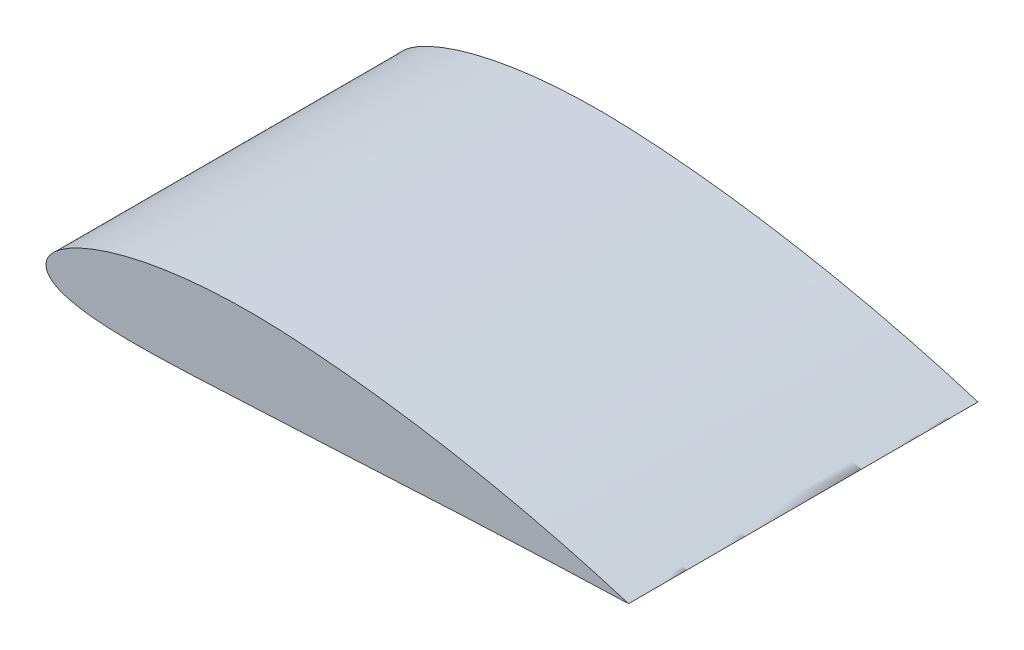
ISO-10303-21;
HEADER;
FILE_DESCRIPTION(('STEP AP214'),'2;1');
FILE_NAME('part.step','',(''),(''),'','','');
FILE_SCHEMA(('AUTOMOTIVE_DESIGN { 1 0 10303 214 1 1 1 1 }'));
ENDSEC;
DATA;
#1=APPLICATION_CONTEXT('core data for automotive mechanical design processes');
#2=APPLICATION_PROTOCOL_DEFINITION('international standard','automotive_design',2000,#1);
#3=PRODUCT_CONTEXT('',#1,'mechanical');
#4=PRODUCT('Part','Part','',(#3));
#5=PRODUCT_RELATED_PRODUCT_CATEGORY('part','',(#4));
#6=PRODUCT_DEFINITION_FORMATION('','',#4);
#7=PRODUCT_DEFINITION_CONTEXT('part definition',#1,'design');
#8=PRODUCT_DEFINITION('design','',#6,#7);
#9=PRODUCT_DEFINITION_SHAPE('','',#8);
#10=(LENGTH_UNIT() NAMED_UNIT(*) SI_UNIT(.MILLI.,.METRE.));
#11=(NAMED_UNIT(*) PLANE_ANGLE_UNIT() SI_UNIT($,.RADIAN.));
#12=(NAMED_UNIT(*) SI_UNIT($,.STERADIAN.) SOLID_ANGLE_UNIT());
#13=UNCERTAINTY_MEASURE_WITH_UNIT(LENGTH_MEASURE(1.E-05),#10,'distance_accuracy_value','');
#14=(GEOMETRIC_REPRESENTATION_CONTEXT(3) GLOBAL_UNCERTAINTY_ASSIGNED_CONTEXT((#13)) GLOBAL_UNIT_ASSIGNED_CONTEXT((#10,
#11,#12)) REPRESENTATION_CONTEXT('',''));
#15=CARTESIAN_POINT('',(0.,0.,0.));
#16=DIRECTION('',(0.,0.,1.));
#17=DIRECTION('',(1.,0.,0.));
#18=AXIS2_PLACEMENT_3D('',#15,#16,#17);
#19=CARTESIAN_POINT('',(150.,0.,90.));
#20=CARTESIAN_POINT('',(150.000272104422,0.00207689023263009,90.));
#21=CARTESIAN_POINT('',(149.921973551547,0.0208426262092277,90.));
#22=CARTESIAN_POINT('',(149.842519038282,0.0504847005717194,90.));
#23=CARTESIAN_POINT('',(149.645315709545,0.108295906032166,90.));
#24=CARTESIAN_POINT('',(149.399874004555,0.184870334594353,90.));
#25=CARTESIAN_POINT('',(149.072414173413,0.284434688746268,90.));
#26=CARTESIAN_POINT('',(148.677343737494,0.405292385609757,90.));
#27=CARTESIAN_POINT('',(148.209483066083,0.546896462907407,90.));
#28=CARTESIAN_POINT('',(147.671383631488,0.709511432527617,90.));
#29=CARTESIAN_POINT('',(147.062641823663,0.892173175665108,90.));
#30=CARTESIAN_POINT('',(146.38404891698,1.09421049196099,90.));
#31=CARTESIAN_POINT('',(145.636148319458,1.31544577946298,90.));
#32=CARTESIAN_POINT('',(144.819611323107,1.55506497229126,90.));
#33=CARTESIAN_POINT('',(143.935051630073,1.81221578260426,90.));
#34=CARTESIAN_POINT('',(142.98329626284,2.08618396516425,90.));
#35=CARTESIAN_POINT('',(141.965168506429,2.37612722327041,90.));
#36=CARTESIAN_POINT('',(140.881543015728,2.6815104069107,90.));
#37=CARTESIAN_POINT('',(139.733311673354,3.00109894583133,90.));
#38=CARTESIAN_POINT('',(138.521573964146,3.33443569112062,90.));
#39=CARTESIAN_POINT('',(137.247259695871,3.67967787535828,90.));
#40=CARTESIAN_POINT('',(135.911779029487,4.03729575748827,90.));
#41=CARTESIAN_POINT('',(134.515919656966,4.40471208076963,90.));
#42=CARTESIAN_POINT('',(133.061288331017,4.78231347303156,90.));
#43=CARTESIAN_POINT('',(131.548973045965,5.16800610284615,90.));
#44=CARTESIAN_POINT('',(129.980544735221,5.56154750441059,90.));
#45=CARTESIAN_POINT('',(128.35725708645,5.96141132811702,90.));
#46=CARTESIAN_POINT('',(126.680668839588,6.36693677300439,90.));
#47=CARTESIAN_POINT('',(124.952285557257,6.77668675307357,90.));
#48=CARTESIAN_POINT('',(123.173710005076,7.18982645179692,90.));
#49=CARTESIAN_POINT('',(121.346696760796,7.60533214426128,90.));
#50=CARTESIAN_POINT('',(119.472806812605,8.02202963775829,90.));
#51=CARTESIAN_POINT('',(117.553944689906,8.43906525798075,90.));
#52=CARTESIAN_POINT('',(115.591819417726,8.85520805754498,90.));
#53=CARTESIAN_POINT('',(113.588294477563,9.26926792690191,90.));
#54=CARTESIAN_POINT('',(111.545360234912,9.68088947320699,90.));
#55=CARTESIAN_POINT('',(109.464827039027,10.0881802086501,90.));
#56=CARTESIAN_POINT('',(107.348799553894,10.490864841984,90.));
#57=CARTESIAN_POINT('',(105.199373577835,10.8876864936163,90.));
#58=CARTESIAN_POINT('',(103.018484494341,11.277318393923,90.));
#59=CARTESIAN_POINT('',(100.808431903456,11.6595648966439,90.));
#60=CARTESIAN_POINT('',(98.5711340995122,12.0325224405796,90.));
#61=CARTESIAN_POINT('',(96.3089959207087,12.3961047323509,90.));
#62=CARTESIAN_POINT('',(94.0241310079003,12.7489466185652,90.));
#63=CARTESIAN_POINT('',(91.718883116714,13.0903325986072,90.));
#64=CARTESIAN_POINT('',(89.3954275691228,13.4189345008477,90.));
#65=CARTESIAN_POINT('',(87.0562887944019,13.7347453196045,90.));
#66=CARTESIAN_POINT('',(84.7036052332807,14.0361643345996,90.));
#67=CARTESIAN_POINT('',(82.3398249346409,14.3226387688156,90.));
#68=CARTESIAN_POINT('',(79.967325410036,14.5932708330258,90.));
#69=CARTESIAN_POINT('',(77.5885654116206,14.8478211325833,90.));
#70=CARTESIAN_POINT('',(75.2058897790264,15.0846236941612,90.));
#71=CARTESIAN_POINT('',(72.8217697700285,15.3041043020901,90.));
#72=CARTESIAN_POINT('',(70.4386522230854,15.5045852412791,90.));
#73=CARTESIAN_POINT('',(68.0589891278915,15.68594497707,90.));
#74=CARTESIAN_POINT('',(65.6852844488684,15.8477677068933,90.));
#75=CARTESIAN_POINT('',(63.3199558506742,15.9890376852295,90.));
#76=CARTESIAN_POINT('',(60.9569868820646,16.1102204847538,90.));
#77=CARTESIAN_POINT('',(58.5927592112426,16.2095296702894,90.));
#78=CARTESIAN_POINT('',(56.2293299635351,16.2751546551305,90.));
#79=CARTESIAN_POINT('',(53.8780778954161,16.3100321973821,90.));
#80=CARTESIAN_POINT('',(51.5475071673821,16.3124265374074,90.));
#81=CARTESIAN_POINT('',(49.2403315805647,16.2832747914698,90.));
#82=CARTESIAN_POINT('',(46.95915252198,16.2221891848616,90.));
#83=CARTESIAN_POINT('',(44.7066225129721,16.1297818940888,90.));
#84=CARTESIAN_POINT('',(42.4853651736782,16.0066871374737,90.));
#85=CARTESIAN_POINT('',(40.2979451525518,15.8525073101211,90.));
#86=CARTESIAN_POINT('',(38.146881081899,15.6689733062392,90.));
#87=CARTESIAN_POINT('',(36.0346303680516,15.4560352697872,90.));
#88=CARTESIAN_POINT('',(33.963718149193,15.2147017968168,90.));
#89=CARTESIAN_POINT('',(31.9364386243261,14.9456064642803,90.));
#90=CARTESIAN_POINT('',(29.9550852199295,14.650431122317,90.));
#91=CARTESIAN_POINT('',(28.0219995377294,14.329328289204,90.));
#92=CARTESIAN_POINT('',(26.1393036636904,13.9841488004247,90.));
#93=CARTESIAN_POINT('',(24.3090897042164,13.6156080862152,90.));
#94=CARTESIAN_POINT('',(22.5333910183897,13.2252998236428,90.));
#95=CARTESIAN_POINT('',(20.8141570646472,12.8143397994462,90.));
#96=CARTESIAN_POINT('',(19.1532625454956,12.3843673513931,90.));
#97=CARTESIAN_POINT('',(17.5525314026896,11.9363688305201,90.));
#98=CARTESIAN_POINT('',(16.0135453188172,11.4723789338875,90.));
#99=CARTESIAN_POINT('',(14.5379658289888,10.9933978448908,90.));
#100=CARTESIAN_POINT('',(13.1271795372412,10.5014156983785,90.));
#101=CARTESIAN_POINT('',(11.7826686973959,9.99758517013954,90.));
#102=CARTESIAN_POINT('',(10.5056360590066,9.4838301684593,90.));
#103=CARTESIAN_POINT('',(9.29757901129565,8.96091465996717,90.));
#104=CARTESIAN_POINT('',(8.15912225204376,8.43145219524066,90.));
#105=CARTESIAN_POINT('',(7.09167230019978,7.89594980567053,90.));
#106=CARTESIAN_POINT('',(6.09590939489857,7.35643565975766,90.));
#107=CARTESIAN_POINT('',(5.17279962443279,6.81404781774696,90.));
#108=CARTESIAN_POINT('',(4.32279616189373,6.27049877334772,90.));
#109=CARTESIAN_POINT('',(3.54682092194692,5.72651568455543,90.));
#110=CARTESIAN_POINT('',(2.84510723373929,5.18373587366653,90.));
#111=CARTESIAN_POINT('',(2.21827152938012,4.64301683836837,90.));
#112=CARTESIAN_POINT('',(1.66642319468661,4.10552051561501,90.));
#113=CARTESIAN_POINT('',(1.19023442450698,3.57175180699062,90.));
#114=CARTESIAN_POINT('',(0.789296727509486,3.04299046760465,90.));
#115=CARTESIAN_POINT('',(0.464285946917065,2.51936680432351,90.));
#116=CARTESIAN_POINT('',(0.215278880105339,2.00137620213908,90.));
#117=CARTESIAN_POINT('',(0.0428613380577646,1.48932579315468,90.));
#118=CARTESIAN_POINT('',(-0.0530580273602537,0.983851334380554,90.));
#119=CARTESIAN_POINT('',(-0.0712450306698294,0.485498463442419,90.));
#120=CARTESIAN_POINT('',(-0.0123592269447209,-0.00244835719853685,90.));
#121=CARTESIAN_POINT('',(0.120911740768983,-0.475516589249274,90.));
#122=CARTESIAN_POINT('',(0.328830225920756,-0.928469081351905,90.));
#123=CARTESIAN_POINT('',(0.609334298301053,-1.35888318721454,90.));
#124=CARTESIAN_POINT('',(0.961345567012049,-1.76664058544736,90.));
#125=CARTESIAN_POINT('',(1.38409496464228,-2.15163877482725,90.));
#126=CARTESIAN_POINT('',(1.87590746344579,-2.51503021404955,90.));
#127=CARTESIAN_POINT('',(2.43666954822375,-2.85634814965635,90.));
#128=CARTESIAN_POINT('',(3.06497712351144,-3.17677195967994,90.));
#129=CARTESIAN_POINT('',(3.7605653241109,-3.47575656065418,90.));
#130=CARTESIAN_POINT('',(4.52231400391344,-3.75406636830128,90.));
#131=CARTESIAN_POINT('',(5.34942075072481,-4.01191058827112,90.));
#132=CARTESIAN_POINT('',(6.24095359325865,-4.24910176197436,90.));
#133=CARTESIAN_POINT('',(7.19569142683817,-4.46648601041969,90.));
#134=CARTESIAN_POINT('',(8.21269572499256,-4.66365365837422,90.));
#135=CARTESIAN_POINT('',(9.2906866946272,-4.84135328610298,90.));
#136=CARTESIAN_POINT('',(10.4285899742934,-4.99972555658686,90.));
#137=CARTESIAN_POINT('',(11.6251376394179,-5.13937440763286,90.));
#138=CARTESIAN_POINT('',(12.8791605932049,-5.26011203158123,90.));
#139=CARTESIAN_POINT('',(14.1891859121837,-5.36318678706131,90.));
#140=CARTESIAN_POINT('',(15.5539508874596,-5.44820802642055,90.));
#141=CARTESIAN_POINT('',(16.9721094758421,-5.51634875324073,90.));
#142=CARTESIAN_POINT('',(18.4422950309709,-5.56780595958454,90.));
#143=CARTESIAN_POINT('',(19.9631039142276,-5.60321399111864,90.));
#144=CARTESIAN_POINT('',(21.5330881522841,-5.62350162104073,90.));
#145=CARTESIAN_POINT('',(23.1508061715703,-5.62874343844123,90.));
#146=CARTESIAN_POINT('',(24.8148063330218,-5.62040842866065,90.));
#147=CARTESIAN_POINT('',(26.5235445975624,-5.59884059450155,90.));
#148=CARTESIAN_POINT('',(28.2756160734194,-5.56474396820487,90.));
#149=CARTESIAN_POINT('',(30.0694858054297,-5.51946038531307,90.));
#150=CARTESIAN_POINT('',(31.9036890589317,-5.46322094926999,90.));
#151=CARTESIAN_POINT('',(33.7766353517987,-5.3972971211312,90.));
#152=CARTESIAN_POINT('',(35.6867790146822,-5.3227207637968,90.));
#153=CARTESIAN_POINT('',(37.6325678885514,-5.24034726975759,90.));
#154=CARTESIAN_POINT('',(39.6124008659453,-5.15108325425804,90.));
#155=CARTESIAN_POINT('',(41.6246745232964,-5.05590145858239,90.));
#156=CARTESIAN_POINT('',(43.6677620509226,-4.95625598076368,90.));
#157=CARTESIAN_POINT('',(45.7400314366859,-4.85252429231329,90.));
#158=CARTESIAN_POINT('',(47.8398139361709,-4.74627490480082,90.));
#159=CARTESIAN_POINT('',(49.965432617321,-4.63805694152593,90.));
#160=CARTESIAN_POINT('',(52.1151156255718,-4.52941650554317,90.));
#161=CARTESIAN_POINT('',(54.2871400595198,-4.42093378617178,90.));
#162=CARTESIAN_POINT('',(56.4797286201269,-4.31402206765908,90.));
#163=CARTESIAN_POINT('',(58.6969908713433,-4.20849141314161,90.));
#164=CARTESIAN_POINT('',(60.945654882775,-4.10769870768404,90.));
#165=CARTESIAN_POINT('',(63.2232486042912,-4.002236598618,90.));
#166=CARTESIAN_POINT('',(65.5216321109667,-3.89137688011704,90.));
#167=CARTESIAN_POINT('',(67.8301729941364,-3.77675196819679,90.));
#168=CARTESIAN_POINT('',(70.1466614694952,-3.65879491545977,90.));
#169=CARTESIAN_POINT('',(72.4689996031601,-3.53814745300053,90.));
#170=CARTESIAN_POINT('',(74.794988032,-3.4154165014781,90.));
#171=CARTESIAN_POINT('',(77.1224243615471,-3.29115474286348,90.));
#172=CARTESIAN_POINT('',(79.4490677808488,-3.16607980540334,90.));
#173=CARTESIAN_POINT('',(81.7726976546475,-3.04040655331903,90.));
#174=CARTESIAN_POINT('',(84.0911495605708,-2.91524183791421,90.));
#175=CARTESIAN_POINT('',(86.402140444334,-2.79042292169453,90.));
#176=CARTESIAN_POINT('',(88.7034754404547,-2.66644219496335,90.));
#177=CARTESIAN_POINT('',(90.9928775044559,-2.54412756405056,90.));
#178=CARTESIAN_POINT('',(93.2681170734066,-2.42332668707761,90.));
#179=CARTESIAN_POINT('',(95.5269618333438,-2.30466849275584,90.));
#180=CARTESIAN_POINT('',(97.7672176064783,-2.18852225501992,90.));
#181=CARTESIAN_POINT('',(99.986655582846,-2.07457755662578,90.));
#182=CARTESIAN_POINT('',(102.183061875341,-1.96368989137843,90.));
#183=CARTESIAN_POINT('',(104.354254639672,-1.85548180982117,90.));
#184=CARTESIAN_POINT('',(106.498058518328,-1.75054532192651,90.));
#185=CARTESIAN_POINT('',(108.612361753783,-1.64874965871514,90.));
#186=CARTESIAN_POINT('',(110.695005571574,-1.55000356799861,90.));
#187=CARTESIAN_POINT('',(112.743858693049,-1.45480231912397,90.));
#188=CARTESIAN_POINT('',(114.75681445434,-1.36306322999739,90.));
#189=CARTESIAN_POINT('',(116.731816593225,-1.27459804108363,90.));
#190=CARTESIAN_POINT('',(118.666913818065,-1.18936990866941,90.));
#191=CARTESIAN_POINT('',(120.560070381475,-1.10770755043036,90.));
#192=CARTESIAN_POINT('',(122.409370825866,-1.02925607680544,90.));
#193=CARTESIAN_POINT('',(124.212822591308,-0.954136034758562,90.));
#194=CARTESIAN_POINT('',(125.968576681431,-0.882324845493759,90.));
#195=CARTESIAN_POINT('',(127.674782259508,-0.813706732262509,90.));
#196=CARTESIAN_POINT('',(129.32962435176,-0.747897389263747,90.));
#197=CARTESIAN_POINT('',(130.931437587357,-0.685679095937559,90.));
#198=CARTESIAN_POINT('',(132.478432692498,-0.626047056681713,90.));
#199=CARTESIAN_POINT('',(133.968988768561,-0.569602131419002,90.));
#200=CARTESIAN_POINT('',(135.401534107448,-0.51582272078192,90.));
#201=CARTESIAN_POINT('',(136.774542373877,-0.465242147692284,90.));
#202=CARTESIAN_POINT('',(138.086542097674,-0.417233039970525,90.));
#203=CARTESIAN_POINT('',(139.33604307386,-0.371958079112704,90.));
#204=CARTESIAN_POINT('',(140.521692905702,-0.329351465651246,90.));
#205=CARTESIAN_POINT('',(141.642247059827,-0.289517314442345,90.));
#206=CARTESIAN_POINT('',(142.696444473822,-0.252142887573603,90.));
#207=CARTESIAN_POINT('',(143.683143638872,-0.21746993774922,90.));
#208=CARTESIAN_POINT('',(144.601252193673,-0.185655736937105,90.));
#209=CARTESIAN_POINT('',(145.449743160385,-0.155977193568038,90.));
#210=CARTESIAN_POINT('',(146.227705394211,-0.129275623987621,90.));
#211=CARTESIAN_POINT('',(146.934186609138,-0.104721156283502,90.));
#212=CARTESIAN_POINT('',(147.568527129019,-0.0830159570641429,90.));
#213=CARTESIAN_POINT('',(148.129765475862,-0.0638850729192039,90.));
#214=CARTESIAN_POINT('',(148.617909888636,-0.0470248496208151,90.));
#215=CARTESIAN_POINT('',(149.030589151948,-0.0328618602439431,90.));
#216=CARTESIAN_POINT('',(149.372579095089,-0.0216487935241916,90.));
#217=CARTESIAN_POINT('',(149.629433267964,-0.0117842854812042,90.));
#218=CARTESIAN_POINT('',(149.834846904295,-0.00732139561684935,90.));
#219=CARTESIAN_POINT('',(149.919239993652,5.47711858839539E-05,90.));
#220=CARTESIAN_POINT('',(149.999727835646,-0.00207734766865694,90.));
#221=CARTESIAN_POINT('',(150.,0.,90.));
#222=B_SPLINE_CURVE_WITH_KNOTS('',3,(#19,#20,#21,#22,#23,#24,#25,#26,#27,#28,#29,#30,#31,#32,
#33,#34,#35,#36,#37,#38,#39,#40,#41,#42,#43,#44,#45,#46,#47,#48,#49,#50,#51,#52,#53,#54,#55,#56,
#57,#58,#59,#60,#61,#62,#63,#64,#65,#66,#67,#68,#69,#70,#71,#72,#73,#74,#75,#76,#77,#78,#79,#80,
#81,#82,#83,#84,#85,#86,#87,#88,#89,#90,#91,#92,#93,#94,#95,#96,#97,#98,#99,#100,#101,#102,#103,
#104,#105,#106,#107,#108,#109,#110,#111,#112,#113,#114,#115,#116,#117,#118,#119,#120,#121,#122,
#123,#124,#125,#126,#127,#128,#129,#130,#131,#132,#133,#134,#135,#136,#137,#138,#139,#140,#141,
#142,#143,#144,#145,#146,#147,#148,#149,#150,#151,#152,#153,#154,#155,#156,#157,#158,#159,#160,
#161,#162,#163,#164,#165,#166,#167,#168,#169,#170,#171,#172,#173,#174,#175,#176,#177,#178,#179,
#180,#181,#182,#183,#184,#185,#186,#187,#188,#189,#190,#191,#192,#193,#194,#195,#196,#197,#198,
#199,#200,#201,#202,#203,#204,#205,#206,#207,#208,#209,#210,#211,#212,#213,#214,#215,#216,#217,
#218,#219,#220,#221),.UNSPECIFIED.,.T.,.F.,(4,1,1,1,1,1,1,1,1,1,1,1,1,1,1,1,1,1,1,1,1,1,1,1,1,1,
1,1,1,1,1,1,1,1,1,1,1,1,1,1,1,1,1,1,1,1,1,1,1,1,1,1,1,1,1,1,1,1,1,1,1,1,1,1,1,1,1,1,1,1,1,1,1,1,
1,1,1,1,1,1,1,1,1,1,1,1,1,1,1,1,1,1,1,1,1,1,1,1,1,1,1,1,1,1,1,1,1,1,1,1,1,1,1,1,1,1,1,1,1,1,1,1,
1,1,1,1,1,1,1,1,1,1,1,1,1,1,1,1,1,1,1,1,1,1,1,1,1,1,1,1,1,1,1,1,1,1,1,1,1,1,1,1,1,1,1,1,1,1,1,1,
1,1,1,1,1,1,1,1,1,1,1,1,1,1,1,1,1,1,1,1,1,1,1,1,1,1,1,1,1,1,4),(0.,0.000122422828839157,
0.000490298205700145,0.00110255506390439,0.00195844392313843,0.00305782313682848,
0.00439915824740053,0.00598081444162225,0.00780186545934247,0.0098597540126122,
0.0121529991402356,0.0146784015102063,0.017434489422682,0.0204176618823767,0.0236249293938348,
0.0270533109183729,0.0306988993820388,0.0345590675651448,0.0386288621356098,0.0429044907870312,
0.0473814047289724,0.0520560621940718,0.0569228701256559,0.0619770440676096,0.0672138312728649,
0.0726276654449745,0.0782137039729309,0.0839664212010317,0.0898790078384448,0.0959471454001074,
0.102163477792219,0.108522776055466,0.11501820073611,0.121643513157645,0.128392212852828,
0.135257909798513,0.142233186288123,0.1493118875203,0.156485889191421,0.163749344013372,
0.171094574799935,0.178514335635915,0.186001163438331,0.193548179834618,0.201147023872415,
0.208791073568669,0.216471957357076,0.224182975921803,0.231916010526288,0.239663021163805,
0.247417292842311,0.255170456671203,0.262915394652601,0.270643749071102,0.278348636610778,
0.286022173536587,0.293656579761078,0.301327822577955,0.309003340180379,0.316618403006632,
0.324165152015642,0.33163723487694,0.339026873217374,0.346327255948597,0.353531576101981,
0.360632140558097,0.367623499774598,0.374497927979314,0.381249571009798,0.387871561559752,
0.394358819251997,0.400704068555248,0.406902136932548,0.412947530292161,0.41883505101971,
0.42455854770007,0.430114239412916,0.435496479688594,0.440701255658541,0.445724380177024,
0.450562341192749,0.455210912481354,0.45966778037805,0.463929585163789,0.467994131176176,
0.471860161911679,0.475526302463728,0.478991291686383,0.482256230976834,0.485322520681699,
0.488191947503567,0.490868561228993,0.493358157113654,0.495668334509018,0.497809261720138,
0.49979495706838,0.501643842068358,0.503378773628841,0.505027615267354,0.506623310634956,
0.508202657822506,0.509781785660997,0.511377441497342,0.51302434628626,0.51475490343052,
0.51659498688598,0.518566255706567,0.520684835659339,0.522963484651294,0.525410584140381,
0.528033540877387,0.530836485855735,0.533821918823463,0.536991085527386,0.540344425940847,
0.543881487602864,0.547600641430003,0.551501291689608,0.555580420806779,0.559835369972453,
0.564263041405136,0.568860256025612,0.573624064669735,0.578549924806617,0.583634130339101,
0.588872840218485,0.594261146907344,0.599795014501931,0.605469357934132,0.611280456538929,
0.617222619255098,0.62329151994597,0.629481809344693,0.635788115991735,0.642206008193892,
0.64872955113947,0.655353249381793,0.662072147182511,0.668880721868356,0.675772523053001,
0.682742989351182,0.689785185824754,0.696893613867955,0.704062807723137,0.711343694646753,
0.718754658005057,0.726206592095733,0.733691639231199,0.741202927049096,0.748733577057533,
0.756276705774257,0.76382445598004,0.771369937446016,0.778905799316919,0.786424637464997,
0.793919637165807,0.801382961649521,0.80880771853849,0.816186124437812,0.82351131492777,
0.830775967617128,0.837972810984086,0.845094984238871,0.852134731545124,0.859085703844137,
0.865940630470846,0.872692725152488,0.879335155888888,0.885860651770684,0.892262933222698,
0.898535697698911,0.904672621273621,0.910666451584559,0.916512340382269,0.922203013225339,
0.92773267040238,0.933096481433812,0.93828761703315,0.94330128355127,0.948132125943641,
0.952774340811119,0.957224029064454,0.961475889518515,0.965525069871358,0.969367203001699,
0.972998406995219,0.976414817021268,0.979612048421107,0.982587189688221,0.985336877589934,
0.987857681300261,0.990147207881231,0.992202511995501,0.994021669130129,0.995602269338075,
0.996942823396074,0.998041891979453,0.998898019125339,0.999509748874024,0.999877550207477,1.),.UNSPECIFIED.);
#223=DIRECTION('',(0.,0.,-1.));
#224=VECTOR('',#223,1.);
#225=SURFACE_OF_LINEAR_EXTRUSION('',#222,#224);
#226=CARTESIAN_POINT('',(150.,0.,90.));
#227=VERTEX_POINT('',#226);
#228=EDGE_CURVE('E10',#227,#227,#222,.T.);
#229=ORIENTED_EDGE('',*,*,#228,.F.);
#230=EDGE_LOOP('',(#229));
#231=FACE_BOUND('',#230,.T.);
#232=CARTESIAN_POINT('',(150.,0.,0.));
#233=CARTESIAN_POINT('',(150.000272104422,0.00207689023263009,0.));
#234=CARTESIAN_POINT('',(149.921973551547,0.0208426262092277,0.));
#235=CARTESIAN_POINT('',(149.842519038282,0.0504847005717194,0.));
#236=CARTESIAN_POINT('',(149.645315709545,0.108295906032166,0.));
#237=CARTESIAN_POINT('',(149.399874004555,0.184870334594353,0.));
#238=CARTESIAN_POINT('',(149.072414173413,0.284434688746268,0.));
#239=CARTESIAN_POINT('',(148.677343737494,0.405292385609757,0.));
#240=CARTESIAN_POINT('',(148.209483066083,0.546896462907407,0.));
#241=CARTESIAN_POINT('',(147.671383631488,0.709511432527617,0.));
#242=CARTESIAN_POINT('',(147.062641823663,0.892173175665108,0.));
#243=CARTESIAN_POINT('',(146.38404891698,1.09421049196099,0.));
#244=CARTESIAN_POINT('',(145.636148319458,1.31544577946298,0.));
#245=CARTESIAN_POINT('',(144.819611323107,1.55506497229126,0.));
#246=CARTESIAN_POINT('',(143.935051630073,1.81221578260426,0.));
#247=CARTESIAN_POINT('',(142.98329626284,2.08618396516425,0.));
#248=CARTESIAN_POINT('',(141.965168506429,2.37612722327041,0.));
#249=CARTESIAN_POINT('',(140.881543015728,2.6815104069107,0.));
#250=CARTESIAN_POINT('',(139.733311673354,3.00109894583133,0.));
#251=CARTESIAN_POINT('',(138.521573964146,3.33443569112062,0.));
#252=CARTESIAN_POINT('',(137.247259695871,3.67967787535828,0.));
#253=CARTESIAN_POINT('',(135.911779029487,4.03729575748827,0.));
#254=CARTESIAN_POINT('',(134.515919656966,4.40471208076963,0.));
#255=CARTESIAN_POINT('',(133.061288331017,4.78231347303156,0.));
#256=CARTESIAN_POINT('',(131.548973045965,5.16800610284615,0.));
#257=CARTESIAN_POINT('',(129.980544735221,5.56154750441059,0.));
#258=CARTESIAN_POINT('',(128.35725708645,5.96141132811702,0.));
#259=CARTESIAN_POINT('',(126.680668839588,6.36693677300439,0.));
#260=CARTESIAN_POINT('',(124.952285557257,6.77668675307357,0.));
#261=CARTESIAN_POINT('',(123.173710005076,7.18982645179692,0.));
#262=CARTESIAN_POINT('',(121.346696760796,7.60533214426128,0.));
#263=CARTESIAN_POINT('',(119.472806812605,8.02202963775829,0.));
#264=CARTESIAN_POINT('',(117.553944689906,8.43906525798075,0.));
#265=CARTESIAN_POINT('',(115.591819417726,8.85520805754498,0.));
#266=CARTESIAN_POINT('',(113.588294477563,9.26926792690191,0.));
#267=CARTESIAN_POINT('',(111.545360234912,9.68088947320699,0.));
#268=CARTESIAN_POINT('',(109.464827039027,10.0881802086501,0.));
#269=CARTESIAN_POINT('',(107.348799553894,10.490864841984,0.));
#270=CARTESIAN_POINT('',(105.199373577835,10.8876864936163,0.));
#271=CARTESIAN_POINT('',(103.018484494341,11.277318393923,0.));
#272=CARTESIAN_POINT('',(100.808431903456,11.6595648966439,0.));
#273=CARTESIAN_POINT('',(98.5711340995122,12.0325224405796,0.));
#274=CARTESIAN_POINT('',(96.3089959207087,12.3961047323509,0.));
#275=CARTESIAN_POINT('',(94.0241310079003,12.7489466185652,0.));
#276=CARTESIAN_POINT('',(91.718883116714,13.0903325986072,0.));
#277=CARTESIAN_POINT('',(89.3954275691228,13.4189345008477,0.));
#278=CARTESIAN_POINT('',(87.0562887944019,13.7347453196045,0.));
#279=CARTESIAN_POINT('',(84.7036052332807,14.0361643345996,0.));
#280=CARTESIAN_POINT('',(82.3398249346409,14.3226387688156,0.));
#281=CARTESIAN_POINT('',(79.967325410036,14.5932708330258,0.));
#282=CARTESIAN_POINT('',(77.5885654116206,14.8478211325833,0.));
#283=CARTESIAN_POINT('',(75.2058897790264,15.0846236941612,0.));
#284=CARTESIAN_POINT('',(72.8217697700285,15.3041043020901,0.));
#285=CARTESIAN_POINT('',(70.4386522230854,15.5045852412791,0.));
#286=CARTESIAN_POINT('',(68.0589891278915,15.68594497707,0.));
#287=CARTESIAN_POINT('',(65.6852844488684,15.8477677068933,0.));
#288=CARTESIAN_POINT('',(63.3199558506742,15.9890376852295,0.));
#289=CARTESIAN_POINT('',(60.9569868820646,16.1102204847538,0.));
#290=CARTESIAN_POINT('',(58.5927592112426,16.2095296702894,0.));
#291=CARTESIAN_POINT('',(56.2293299635351,16.2751546551305,0.));
#292=CARTESIAN_POINT('',(53.8780778954161,16.3100321973821,0.));
#293=CARTESIAN_POINT('',(51.5475071673821,16.3124265374074,0.));
#294=CARTESIAN_POINT('',(49.2403315805647,16.2832747914698,0.));
#295=CARTESIAN_POINT('',(46.95915252198,16.2221891848616,0.));
#296=CARTESIAN_POINT('',(44.7066225129721,16.1297818940888,0.));
#297=CARTESIAN_POINT('',(42.4853651736782,16.0066871374737,0.));
#298=CARTESIAN_POINT('',(40.2979451525518,15.8525073101211,0.));
#299=CARTESIAN_POINT('',(38.146881081899,15.6689733062392,0.));
#300=CARTESIAN_POINT('',(36.0346303680516,15.4560352697872,0.));
#301=CARTESIAN_POINT('',(33.963718149193,15.2147017968168,0.));
#302=CARTESIAN_POINT('',(31.9364386243261,14.9456064642803,0.));
#303=CARTESIAN_POINT('',(29.9550852199295,14.650431122317,0.));
#304=CARTESIAN_POINT('',(28.0219995377294,14.329328289204,0.));
#305=CARTESIAN_POINT('',(26.1393036636904,13.9841488004247,0.));
#306=CARTESIAN_POINT('',(24.3090897042164,13.6156080862152,0.));
#307=CARTESIAN_POINT('',(22.5333910183897,13.2252998236428,0.));
#308=CARTESIAN_POINT('',(20.8141570646472,12.8143397994462,0.));
#309=CARTESIAN_POINT('',(19.1532625454956,12.3843673513931,0.));
#310=CARTESIAN_POINT('',(17.5525314026896,11.9363688305201,0.));
#311=CARTESIAN_POINT('',(16.0135453188172,11.4723789338875,0.));
#312=CARTESIAN_POINT('',(14.5379658289888,10.9933978448908,0.));
#313=CARTESIAN_POINT('',(13.1271795372412,10.5014156983785,0.));
#314=CARTESIAN_POINT('',(11.7826686973959,9.99758517013954,0.));
#315=CARTESIAN_POINT('',(10.5056360590066,9.4838301684593,0.));
#316=CARTESIAN_POINT('',(9.29757901129565,8.96091465996717,0.));
#317=CARTESIAN_POINT('',(8.15912225204376,8.43145219524066,0.));
#318=CARTESIAN_POINT('',(7.09167230019978,7.89594980567053,0.));
#319=CARTESIAN_POINT('',(6.09590939489857,7.35643565975766,0.));
#320=CARTESIAN_POINT('',(5.17279962443279,6.81404781774696,0.));
#321=CARTESIAN_POINT('',(4.32279616189373,6.27049877334772,0.));
#322=CARTESIAN_POINT('',(3.54682092194692,5.72651568455543,0.));
#323=CARTESIAN_POINT('',(2.84510723373929,5.18373587366653,0.));
#324=CARTESIAN_POINT('',(2.21827152938012,4.64301683836837,0.));
#325=CARTESIAN_POINT('',(1.66642319468661,4.10552051561501,0.));
#326=CARTESIAN_POINT('',(1.19023442450698,3.57175180699062,0.));
#327=CARTESIAN_POINT('',(0.789296727509486,3.04299046760465,0.));
#328=CARTESIAN_POINT('',(0.464285946917065,2.51936680432351,0.));
#329=CARTESIAN_POINT('',(0.215278880105339,2.00137620213908,0.));
#330=CARTESIAN_POINT('',(0.0428613380577646,1.48932579315468,0.));
#331=CARTESIAN_POINT('',(-0.0530580273602537,0.983851334380554,0.));
#332=CARTESIAN_POINT('',(-0.0712450306698294,0.485498463442419,0.));
#333=CARTESIAN_POINT('',(-0.0123592269447209,-0.00244835719853685,0.));
#334=CARTESIAN_POINT('',(0.120911740768983,-0.475516589249274,0.));
#335=CARTESIAN_POINT('',(0.328830225920756,-0.928469081351905,0.));
#336=CARTESIAN_POINT('',(0.609334298301053,-1.35888318721454,0.));
#337=CARTESIAN_POINT('',(0.961345567012049,-1.76664058544736,0.));
#338=CARTESIAN_POINT('',(1.38409496464228,-2.15163877482725,0.));
#339=CARTESIAN_POINT('',(1.87590746344579,-2.51503021404955,0.));
#340=CARTESIAN_POINT('',(2.43666954822375,-2.85634814965635,0.));
#341=CARTESIAN_POINT('',(3.06497712351144,-3.17677195967994,0.));
#342=CARTESIAN_POINT('',(3.7605653241109,-3.47575656065418,0.));
#343=CARTESIAN_POINT('',(4.52231400391344,-3.75406636830128,0.));
#344=CARTESIAN_POINT('',(5.34942075072481,-4.01191058827112,0.));
#345=CARTESIAN_POINT('',(6.24095359325865,-4.24910176197436,0.));
#346=CARTESIAN_POINT('',(7.19569142683817,-4.46648601041969,0.));
#347=CARTESIAN_POINT('',(8.21269572499256,-4.66365365837422,0.));
#348=CARTESIAN_POINT('',(9.2906866946272,-4.84135328610298,0.));
#349=CARTESIAN_POINT('',(10.4285899742934,-4.99972555658686,0.));
#350=CARTESIAN_POINT('',(11.6251376394179,-5.13937440763286,0.));
#351=CARTESIAN_POINT('',(12.8791605932049,-5.26011203158123,0.));
#352=CARTESIAN_POINT('',(14.1891859121837,-5.36318678706131,0.));
#353=CARTESIAN_POINT('',(15.5539508874596,-5.44820802642055,0.));
#354=CARTESIAN_POINT('',(16.9721094758421,-5.51634875324073,0.));
#355=CARTESIAN_POINT('',(18.4422950309709,-5.56780595958454,0.));
#356=CARTESIAN_POINT('',(19.9631039142276,-5.60321399111864,0.));
#357=CARTESIAN_POINT('',(21.5330881522841,-5.62350162104073,0.));
#358=CARTESIAN_POINT('',(23.1508061715703,-5.62874343844123,0.));
#359=CARTESIAN_POINT('',(24.8148063330218,-5.62040842866065,0.));
#360=CARTESIAN_POINT('',(26.5235445975624,-5.59884059450155,0.));
#361=CARTESIAN_POINT('',(28.2756160734194,-5.56474396820487,0.));
#362=CARTESIAN_POINT('',(30.0694858054297,-5.51946038531307,0.));
#363=CARTESIAN_POINT('',(31.9036890589317,-5.46322094926999,0.));
#364=CARTESIAN_POINT('',(33.7766353517987,-5.3972971211312,0.));
#365=CARTESIAN_POINT('',(35.6867790146822,-5.3227207637968,0.));
#366=CARTESIAN_POINT('',(37.6325678885514,-5.24034726975759,0.));
#367=CARTESIAN_POINT('',(39.6124008659453,-5.15108325425804,0.));
#368=CARTESIAN_POINT('',(41.6246745232964,-5.05590145858239,0.));
#369=CARTESIAN_POINT('',(43.6677620509226,-4.95625598076368,0.));
#370=CARTESIAN_POINT('',(45.7400314366859,-4.85252429231329,0.));
#371=CARTESIAN_POINT('',(47.8398139361709,-4.74627490480082,0.));
#372=CARTESIAN_POINT('',(49.965432617321,-4.63805694152593,0.));
#373=CARTESIAN_POINT('',(52.1151156255718,-4.52941650554317,0.));
#374=CARTESIAN_POINT('',(54.2871400595198,-4.42093378617178,0.));
#375=CARTESIAN_POINT('',(56.4797286201269,-4.31402206765908,0.));
#376=CARTESIAN_POINT('',(58.6969908713433,-4.20849141314161,0.));
#377=CARTESIAN_POINT('',(60.945654882775,-4.10769870768404,0.));
#378=CARTESIAN_POINT('',(63.2232486042912,-4.002236598618,0.));
#379=CARTESIAN_POINT('',(65.5216321109667,-3.89137688011704,0.));
#380=CARTESIAN_POINT('',(67.8301729941364,-3.77675196819679,0.));
#381=CARTESIAN_POINT('',(70.1466614694952,-3.65879491545977,0.));
#382=CARTESIAN_POINT('',(72.4689996031601,-3.53814745300053,0.));
#383=CARTESIAN_POINT('',(74.794988032,-3.4154165014781,0.));
#384=CARTESIAN_POINT('',(77.1224243615471,-3.29115474286348,0.));
#385=CARTESIAN_POINT('',(79.4490677808488,-3.16607980540334,0.));
#386=CARTESIAN_POINT('',(81.7726976546475,-3.04040655331903,0.));
#387=CARTESIAN_POINT('',(84.0911495605708,-2.91524183791421,0.));
#388=CARTESIAN_POINT('',(86.402140444334,-2.79042292169453,0.));
#389=CARTESIAN_POINT('',(88.7034754404547,-2.66644219496335,0.));
#390=CARTESIAN_POINT('',(90.9928775044559,-2.54412756405056,0.));
#391=CARTESIAN_POINT('',(93.2681170734066,-2.42332668707761,0.));
#392=CARTESIAN_POINT('',(95.5269618333438,-2.30466849275584,0.));
#393=CARTESIAN_POINT('',(97.7672176064783,-2.18852225501992,0.));
#394=CARTESIAN_POINT('',(99.986655582846,-2.07457755662578,0.));
#395=CARTESIAN_POINT('',(102.183061875341,-1.96368989137843,0.));
#396=CARTESIAN_POINT('',(104.354254639672,-1.85548180982117,0.));
#397=CARTESIAN_POINT('',(106.498058518328,-1.75054532192651,0.));
#398=CARTESIAN_POINT('',(108.612361753783,-1.64874965871514,0.));
#399=CARTESIAN_POINT('',(110.695005571574,-1.55000356799861,0.));
#400=CARTESIAN_POINT('',(112.743858693049,-1.45480231912397,0.));
#401=CARTESIAN_POINT('',(114.75681445434,-1.36306322999739,0.));
#402=CARTESIAN_POINT('',(116.731816593225,-1.27459804108363,0.));
#403=CARTESIAN_POINT('',(118.666913818065,-1.18936990866941,0.));
#404=CARTESIAN_POINT('',(120.560070381475,-1.10770755043036,0.));
#405=CARTESIAN_POINT('',(122.409370825866,-1.02925607680544,0.));
#406=CARTESIAN_POINT('',(124.212822591308,-0.954136034758562,0.));
#407=CARTESIAN_POINT('',(125.968576681431,-0.882324845493759,0.));
#408=CARTESIAN_POINT('',(127.674782259508,-0.813706732262509,0.));
#409=CARTESIAN_POINT('',(129.32962435176,-0.747897389263747,0.));
#410=CARTESIAN_POINT('',(130.931437587357,-0.685679095937559,0.));
#411=CARTESIAN_POINT('',(132.478432692498,-0.626047056681713,0.));
#412=CARTESIAN_POINT('',(133.968988768561,-0.569602131419002,0.));
#413=CARTESIAN_POINT('',(135.401534107448,-0.51582272078192,0.));
#414=CARTESIAN_POINT('',(136.774542373877,-0.465242147692284,0.));
#415=CARTESIAN_POINT('',(138.086542097674,-0.417233039970525,0.));
#416=CARTESIAN_POINT('',(139.33604307386,-0.371958079112704,0.));
#417=CARTESIAN_POINT('',(140.521692905702,-0.329351465651246,0.));
#418=CARTESIAN_POINT('',(141.642247059827,-0.289517314442345,0.));
#419=CARTESIAN_POINT('',(142.696444473822,-0.252142887573603,0.));
#420=CARTESIAN_POINT('',(143.683143638872,-0.21746993774922,0.));
#421=CARTESIAN_POINT('',(144.601252193673,-0.185655736937105,0.));
#422=CARTESIAN_POINT('',(145.449743160385,-0.155977193568038,0.));
#423=CARTESIAN_POINT('',(146.227705394211,-0.129275623987621,0.));
#424=CARTESIAN_POINT('',(146.934186609138,-0.104721156283502,0.));
#425=CARTESIAN_POINT('',(147.568527129019,-0.0830159570641429,0.));
#426=CARTESIAN_POINT('',(148.129765475862,-0.0638850729192039,0.));
#427=CARTESIAN_POINT('',(148.617909888636,-0.0470248496208151,0.));
#428=CARTESIAN_POINT('',(149.030589151948,-0.0328618602439431,0.));
#429=CARTESIAN_POINT('',(149.372579095089,-0.0216487935241916,0.));
#430=CARTESIAN_POINT('',(149.629433267964,-0.0117842854812042,0.));
#431=CARTESIAN_POINT('',(149.834846904295,-0.00732139561684935,0.));
#432=CARTESIAN_POINT('',(149.919239993652,5.47711858839539E-05,0.));
#433=CARTESIAN_POINT('',(149.999727835646,-0.00207734766865694,0.));
#434=CARTESIAN_POINT('',(150.,0.,0.));
#435=B_SPLINE_CURVE_WITH_KNOTS('',3,(#232,#233,#234,#235,#236,#237,#238,#239,#240,#241,#242,
#243,#244,#245,#246,#247,#248,#249,#250,#251,#252,#253,#254,#255,#256,#257,#258,#259,#260,#261,
#262,#263,#264,#265,#266,#267,#268,#269,#270,#271,#272,#273,#274,#275,#276,#277,#278,#279,#280,
#281,#282,#283,#284,#285,#286,#287,#288,#289,#290,#291,#292,#293,#294,#295,#296,#297,#298,#299,
#300,#301,#302,#303,#304,#305,#306,#307,#308,#309,#310,#311,#312,#313,#314,#315,#316,#317,#318,
#319,#320,#321,#322,#323,#324,#325,#326,#327,#328,#329,#330,#331,#332,#333,#334,#335,#336,#337,
#338,#339,#340,#341,#342,#343,#344,#345,#346,#347,#348,#349,#350,#351,#352,#353,#354,#355,#356,
#357,#358,#359,#360,#361,#362,#363,#364,#365,#366,#367,#368,#369,#370,#371,#372,#373,#374,#375,
#376,#377,#378,#379,#380,#381,#382,#383,#384,#385,#386,#387,#388,#389,#390,#391,#392,#393,#394,
#395,#396,#397,#398,#399,#400,#401,#402,#403,#404,#405,#406,#407,#408,#409,#410,#411,#412,#413,
#414,#415,#416,#417,#418,#419,#420,#421,#422,#423,#424,#425,#426,#427,#428,#429,#430,#431,#432,
#433,#434),.UNSPECIFIED.,.T.,.F.,(4,1,1,1,1,1,1,1,1,1,1,1,1,1,1,1,1,1,1,1,1,1,1,1,1,1,1,1,1,1,1,
1,1,1,1,1,1,1,1,1,1,1,1,1,1,1,1,1,1,1,1,1,1,1,1,1,1,1,1,1,1,1,1,1,1,1,1,1,1,1,1,1,1,1,1,1,1,1,1,
1,1,1,1,1,1,1,1,1,1,1,1,1,1,1,1,1,1,1,1,1,1,1,1,1,1,1,1,1,1,1,1,1,1,1,1,1,1,1,1,1,1,1,1,1,1,1,1,
1,1,1,1,1,1,1,1,1,1,1,1,1,1,1,1,1,1,1,1,1,1,1,1,1,1,1,1,1,1,1,1,1,1,1,1,1,1,1,1,1,1,1,1,1,1,1,1,
1,1,1,1,1,1,1,1,1,1,1,1,1,1,1,1,1,1,1,1,1,1,1,1,1,4),(0.,0.000122422828839157,
0.000490298205700145,0.00110255506390439,0.00195844392313843,0.00305782313682848,
0.00439915824740053,0.00598081444162225,0.00780186545934247,0.0098597540126122,
0.0121529991402356,0.0146784015102063,0.017434489422682,0.0204176618823767,0.0236249293938348,
0.0270533109183729,0.0306988993820388,0.0345590675651448,0.0386288621356098,0.0429044907870312,
0.0473814047289724,0.0520560621940718,0.0569228701256559,0.0619770440676096,0.0672138312728649,
0.0726276654449745,0.0782137039729309,0.0839664212010317,0.0898790078384448,0.0959471454001074,
0.102163477792219,0.108522776055466,0.11501820073611,0.121643513157645,0.128392212852828,
0.135257909798513,0.142233186288123,0.1493118875203,0.156485889191421,0.163749344013372,
0.171094574799935,0.178514335635915,0.186001163438331,0.193548179834618,0.201147023872415,
0.208791073568669,0.216471957357076,0.224182975921803,0.231916010526288,0.239663021163805,
0.247417292842311,0.255170456671203,0.262915394652601,0.270643749071102,0.278348636610778,
0.286022173536587,0.293656579761078,0.301327822577955,0.309003340180379,0.316618403006632,
0.324165152015642,0.33163723487694,0.339026873217374,0.346327255948597,0.353531576101981,
0.360632140558097,0.367623499774598,0.374497927979314,0.381249571009798,0.387871561559752,
0.394358819251997,0.400704068555248,0.406902136932548,0.412947530292161,0.41883505101971,
0.42455854770007,0.430114239412916,0.435496479688594,0.440701255658541,0.445724380177024,
0.450562341192749,0.455210912481354,0.45966778037805,0.463929585163789,0.467994131176176,
0.471860161911679,0.475526302463728,0.478991291686383,0.482256230976834,0.485322520681699,
0.488191947503567,0.490868561228993,0.493358157113654,0.495668334509018,0.497809261720138,
0.49979495706838,0.501643842068358,0.503378773628841,0.505027615267354,0.506623310634956,
0.508202657822506,0.509781785660997,0.511377441497342,0.51302434628626,0.51475490343052,
0.51659498688598,0.518566255706567,0.520684835659339,0.522963484651294,0.525410584140381,
0.528033540877387,0.530836485855735,0.533821918823463,0.536991085527386,0.540344425940847,
0.543881487602864,0.547600641430003,0.551501291689608,0.555580420806779,0.559835369972453,
0.564263041405136,0.568860256025612,0.573624064669735,0.578549924806617,0.583634130339101,
0.588872840218485,0.594261146907344,0.599795014501931,0.605469357934132,0.611280456538929,
0.617222619255098,0.62329151994597,0.629481809344693,0.635788115991735,0.642206008193892,
0.64872955113947,0.655353249381793,0.662072147182511,0.668880721868356,0.675772523053001,
0.682742989351182,0.689785185824754,0.696893613867955,0.704062807723137,0.711343694646753,
0.718754658005057,0.726206592095733,0.733691639231199,0.741202927049096,0.748733577057533,
0.756276705774257,0.76382445598004,0.771369937446016,0.778905799316919,0.786424637464997,
0.793919637165807,0.801382961649521,0.80880771853849,0.816186124437812,0.82351131492777,
0.830775967617128,0.837972810984086,0.845094984238871,0.852134731545124,0.859085703844137,
0.865940630470846,0.872692725152488,0.879335155888888,0.885860651770684,0.892262933222698,
0.898535697698911,0.904672621273621,0.910666451584559,0.916512340382269,0.922203013225339,
0.92773267040238,0.933096481433812,0.93828761703315,0.94330128355127,0.948132125943641,
0.952774340811119,0.957224029064454,0.961475889518515,0.965525069871358,0.969367203001699,
0.972998406995219,0.976414817021268,0.979612048421107,0.982587189688221,0.985336877589934,
0.987857681300261,0.990147207881231,0.992202511995501,0.994021669130129,0.995602269338075,
0.996942823396074,0.998041891979453,0.998898019125339,0.999509748874024,0.999877550207477,1.),.UNSPECIFIED.);
#436=CARTESIAN_POINT('',(150.,0.,0.));
#437=VERTEX_POINT('',#436);
#438=EDGE_CURVE('E47',#437,#437,#435,.T.);
#439=ORIENTED_EDGE('',*,*,#438,.T.);
#440=EDGE_LOOP('',(#439));
#441=FACE_BOUND('',#440,.T.);
#442=ADVANCED_FACE('F43',(#231,#441),#225,.F.);
#443=CARTESIAN_POINT('',(0.436748749969894,2.44605811381191,90.));
#444=DIRECTION('',(0.,0.,-1.));
#445=DIRECTION('',(-1.,0.,0.));
#446=AXIS2_PLACEMENT_3D('',#443,#444,#445);
#447=PLANE('',#446);
#448=ORIENTED_EDGE('',*,*,#228,.T.);
#449=EDGE_LOOP('',(#448));
#450=FACE_BOUND('',#449,.T.);
#451=ADVANCED_FACE('F68',(#450),#447,.F.);
#452=CARTESIAN_POINT('',(0.436748749969894,2.44605811381191,0.));
#453=DIRECTION('',(0.,0.,-1.));
#454=DIRECTION('',(-1.,0.,0.));
#455=AXIS2_PLACEMENT_3D('',#452,#453,#454);
#456=PLANE('',#455);
#457=ORIENTED_EDGE('',*,*,#438,.F.);
#458=EDGE_LOOP('',(#457));
#459=FACE_BOUND('',#458,.T.);
#460=ADVANCED_FACE('F66',(#459),#456,.T.);
#461=CLOSED_SHELL('',(#442,#451,#460));
#462=MANIFOLD_SOLID_BREP('B2',#461);
#463=ADVANCED_BREP_SHAPE_REPRESENTATION('',(#18,#462),#14);
#464=SHAPE_DEFINITION_REPRESENTATION(#9,#463);
ENDSEC;
END-ISO-10303-21;
